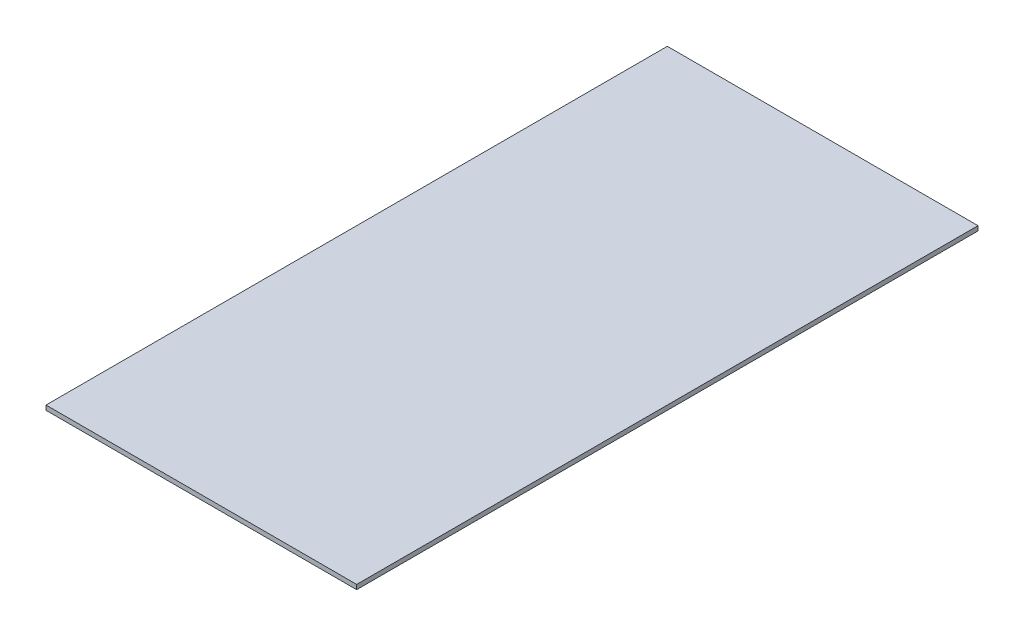
ISO-10303-21;
HEADER;
FILE_DESCRIPTION(('STEP AP214'),'2;1');
FILE_NAME('part.step','',(''),(''),'','','');
FILE_SCHEMA(('AUTOMOTIVE_DESIGN { 1 0 10303 214 1 1 1 1 }'));
ENDSEC;
DATA;
#1=APPLICATION_CONTEXT('core data for automotive mechanical design processes');
#2=APPLICATION_PROTOCOL_DEFINITION('international standard','automotive_design',2000,#1);
#3=PRODUCT_CONTEXT('',#1,'mechanical');
#4=PRODUCT('Part','Part','',(#3));
#5=PRODUCT_RELATED_PRODUCT_CATEGORY('part','',(#4));
#6=PRODUCT_DEFINITION_FORMATION('','',#4);
#7=PRODUCT_DEFINITION_CONTEXT('part definition',#1,'design');
#8=PRODUCT_DEFINITION('design','',#6,#7);
#9=PRODUCT_DEFINITION_SHAPE('','',#8);
#10=(LENGTH_UNIT() NAMED_UNIT(*) SI_UNIT(.MILLI.,.METRE.));
#11=(NAMED_UNIT(*) PLANE_ANGLE_UNIT() SI_UNIT($,.RADIAN.));
#12=(NAMED_UNIT(*) SI_UNIT($,.STERADIAN.) SOLID_ANGLE_UNIT());
#13=UNCERTAINTY_MEASURE_WITH_UNIT(LENGTH_MEASURE(1.E-05),#10,'distance_accuracy_value','');
#14=(GEOMETRIC_REPRESENTATION_CONTEXT(3) GLOBAL_UNCERTAINTY_ASSIGNED_CONTEXT((#13)) GLOBAL_UNIT_ASSIGNED_CONTEXT((#10,
#11,#12)) REPRESENTATION_CONTEXT('',''));
#15=CARTESIAN_POINT('',(0.,0.,0.));
#16=DIRECTION('',(0.,0.,1.));
#17=DIRECTION('',(1.,0.,0.));
#18=AXIS2_PLACEMENT_3D('',#15,#16,#17);
#19=CARTESIAN_POINT('',(-305.,9.,-610.));
#20=DIRECTION('',(1.,0.,0.));
#21=DIRECTION('',(0.,0.,-1.));
#22=AXIS2_PLACEMENT_3D('',#19,#20,#21);
#23=PLANE('',#22);
#24=DIRECTION('',(0.,0.,1.));
#25=VECTOR('',#24,1.);
#26=CARTESIAN_POINT('',(-305.,0.,-610.));
#27=LINE('',#26,#25);
#28=CARTESIAN_POINT('',(-305.,0.,-610.));
#29=VERTEX_POINT('',#28);
#30=CARTESIAN_POINT('',(-305.,0.,610.));
#31=VERTEX_POINT('',#30);
#32=EDGE_CURVE('E96',#29,#31,#27,.T.);
#33=ORIENTED_EDGE('',*,*,#32,.T.);
#34=DIRECTION('',(0.,-1.,0.));
#35=VECTOR('',#34,1.);
#36=CARTESIAN_POINT('',(-305.,9.,610.));
#37=LINE('',#36,#35);
#38=CARTESIAN_POINT('',(-305.,9.,610.));
#39=VERTEX_POINT('',#38);
#40=EDGE_CURVE('E11',#39,#31,#37,.T.);
#41=ORIENTED_EDGE('',*,*,#40,.F.);
#42=DIRECTION('',(0.,0.,1.));
#43=VECTOR('',#42,1.);
#44=CARTESIAN_POINT('',(-305.,9.,-610.));
#45=LINE('',#44,#43);
#46=CARTESIAN_POINT('',(-305.,9.,-610.));
#47=VERTEX_POINT('',#46);
#48=EDGE_CURVE('E84',#47,#39,#45,.T.);
#49=ORIENTED_EDGE('',*,*,#48,.F.);
#50=DIRECTION('',(0.,-1.,0.));
#51=VECTOR('',#50,1.);
#52=CARTESIAN_POINT('',(-305.,9.,-610.));
#53=LINE('',#52,#51);
#54=EDGE_CURVE('E92',#47,#29,#53,.T.);
#55=ORIENTED_EDGE('',*,*,#54,.T.);
#56=EDGE_LOOP('',(#33,#41,#49,#55));
#57=FACE_BOUND('',#56,.T.);
#58=ADVANCED_FACE('F33',(#57),#23,.F.);
#59=CARTESIAN_POINT('',(-305.,9.,610.));
#60=DIRECTION('',(0.,0.,-1.));
#61=DIRECTION('',(-1.,0.,0.));
#62=AXIS2_PLACEMENT_3D('',#59,#60,#61);
#63=PLANE('',#62);
#64=DIRECTION('',(1.,0.,0.));
#65=VECTOR('',#64,1.);
#66=CARTESIAN_POINT('',(-305.,0.,610.));
#67=LINE('',#66,#65);
#68=CARTESIAN_POINT('',(305.,0.,610.));
#69=VERTEX_POINT('',#68);
#70=EDGE_CURVE('E88',#31,#69,#67,.T.);
#71=ORIENTED_EDGE('',*,*,#70,.T.);
#72=DIRECTION('',(0.,-1.,0.));
#73=VECTOR('',#72,1.);
#74=CARTESIAN_POINT('',(305.,9.,610.));
#75=LINE('',#74,#73);
#76=CARTESIAN_POINT('',(305.,9.,610.));
#77=VERTEX_POINT('',#76);
#78=EDGE_CURVE('E41',#77,#69,#75,.T.);
#79=ORIENTED_EDGE('',*,*,#78,.F.);
#80=DIRECTION('',(1.,0.,0.));
#81=VECTOR('',#80,1.);
#82=CARTESIAN_POINT('',(-305.,9.,610.));
#83=LINE('',#82,#81);
#84=EDGE_CURVE('E79',#39,#77,#83,.T.);
#85=ORIENTED_EDGE('',*,*,#84,.F.);
#86=ORIENTED_EDGE('',*,*,#40,.T.);
#87=EDGE_LOOP('',(#71,#79,#85,#86));
#88=FACE_BOUND('',#87,.T.);
#89=ADVANCED_FACE('F87',(#88),#63,.F.);
#90=CARTESIAN_POINT('',(305.,9.,-610.));
#91=DIRECTION('',(-1.,0.,0.));
#92=DIRECTION('',(0.,0.,1.));
#93=AXIS2_PLACEMENT_3D('',#90,#91,#92);
#94=PLANE('',#93);
#95=DIRECTION('',(0.,0.,-1.));
#96=VECTOR('',#95,1.);
#97=CARTESIAN_POINT('',(305.,0.,-610.));
#98=LINE('',#97,#96);
#99=CARTESIAN_POINT('',(305.,0.,-610.));
#100=VERTEX_POINT('',#99);
#101=EDGE_CURVE('E66',#69,#100,#98,.T.);
#102=ORIENTED_EDGE('',*,*,#101,.T.);
#103=DIRECTION('',(0.,-1.,0.));
#104=VECTOR('',#103,1.);
#105=CARTESIAN_POINT('',(305.,9.,-610.));
#106=LINE('',#105,#104);
#107=CARTESIAN_POINT('',(305.,9.,-610.));
#108=VERTEX_POINT('',#107);
#109=EDGE_CURVE('E89',#108,#100,#106,.T.);
#110=ORIENTED_EDGE('',*,*,#109,.F.);
#111=DIRECTION('',(0.,0.,-1.));
#112=VECTOR('',#111,1.);
#113=CARTESIAN_POINT('',(305.,9.,-610.));
#114=LINE('',#113,#112);
#115=EDGE_CURVE('E82',#77,#108,#114,.T.);
#116=ORIENTED_EDGE('',*,*,#115,.F.);
#117=ORIENTED_EDGE('',*,*,#78,.T.);
#118=EDGE_LOOP('',(#102,#110,#116,#117));
#119=FACE_BOUND('',#118,.T.);
#120=ADVANCED_FACE('F90',(#119),#94,.F.);
#121=CARTESIAN_POINT('',(-305.,9.,-610.));
#122=DIRECTION('',(0.,0.,1.));
#123=DIRECTION('',(1.,0.,0.));
#124=AXIS2_PLACEMENT_3D('',#121,#122,#123);
#125=PLANE('',#124);
#126=DIRECTION('',(-1.,0.,0.));
#127=VECTOR('',#126,1.);
#128=CARTESIAN_POINT('',(-305.,0.,-610.));
#129=LINE('',#128,#127);
#130=EDGE_CURVE('E72',#100,#29,#129,.T.);
#131=ORIENTED_EDGE('',*,*,#130,.T.);
#132=ORIENTED_EDGE('',*,*,#54,.F.);
#133=DIRECTION('',(-1.,0.,0.));
#134=VECTOR('',#133,1.);
#135=CARTESIAN_POINT('',(-305.,9.,-610.));
#136=LINE('',#135,#134);
#137=EDGE_CURVE('E49',#108,#47,#136,.T.);
#138=ORIENTED_EDGE('',*,*,#137,.F.);
#139=ORIENTED_EDGE('',*,*,#109,.T.);
#140=EDGE_LOOP('',(#131,#132,#138,#139));
#141=FACE_BOUND('',#140,.T.);
#142=ADVANCED_FACE('F103',(#141),#125,.F.);
#143=CARTESIAN_POINT('',(0.,9.,0.));
#144=DIRECTION('',(0.,1.,0.));
#145=DIRECTION('',(0.,0.,1.));
#146=AXIS2_PLACEMENT_3D('',#143,#144,#145);
#147=PLANE('',#146);
#148=ORIENTED_EDGE('',*,*,#48,.T.);
#149=ORIENTED_EDGE('',*,*,#84,.T.);
#150=ORIENTED_EDGE('',*,*,#115,.T.);
#151=ORIENTED_EDGE('',*,*,#137,.T.);
#152=EDGE_LOOP('',(#148,#149,#150,#151));
#153=FACE_BOUND('',#152,.T.);
#154=ADVANCED_FACE('F80',(#153),#147,.T.);
#155=CARTESIAN_POINT('',(0.,0.,0.));
#156=DIRECTION('',(0.,1.,0.));
#157=DIRECTION('',(0.,0.,1.));
#158=AXIS2_PLACEMENT_3D('',#155,#156,#157);
#159=PLANE('',#158);
#160=ORIENTED_EDGE('',*,*,#32,.F.);
#161=ORIENTED_EDGE('',*,*,#130,.F.);
#162=ORIENTED_EDGE('',*,*,#101,.F.);
#163=ORIENTED_EDGE('',*,*,#70,.F.);
#164=EDGE_LOOP('',(#160,#161,#162,#163));
#165=FACE_BOUND('',#164,.T.);
#166=ADVANCED_FACE('F106',(#165),#159,.F.);
#167=CLOSED_SHELL('',(#58,#89,#120,#142,#154,#166));
#168=MANIFOLD_SOLID_BREP('B2',#167);
#169=ADVANCED_BREP_SHAPE_REPRESENTATION('',(#18,#168),#14);
#170=SHAPE_DEFINITION_REPRESENTATION(#9,#169);
ENDSEC;
END-ISO-10303-21;
